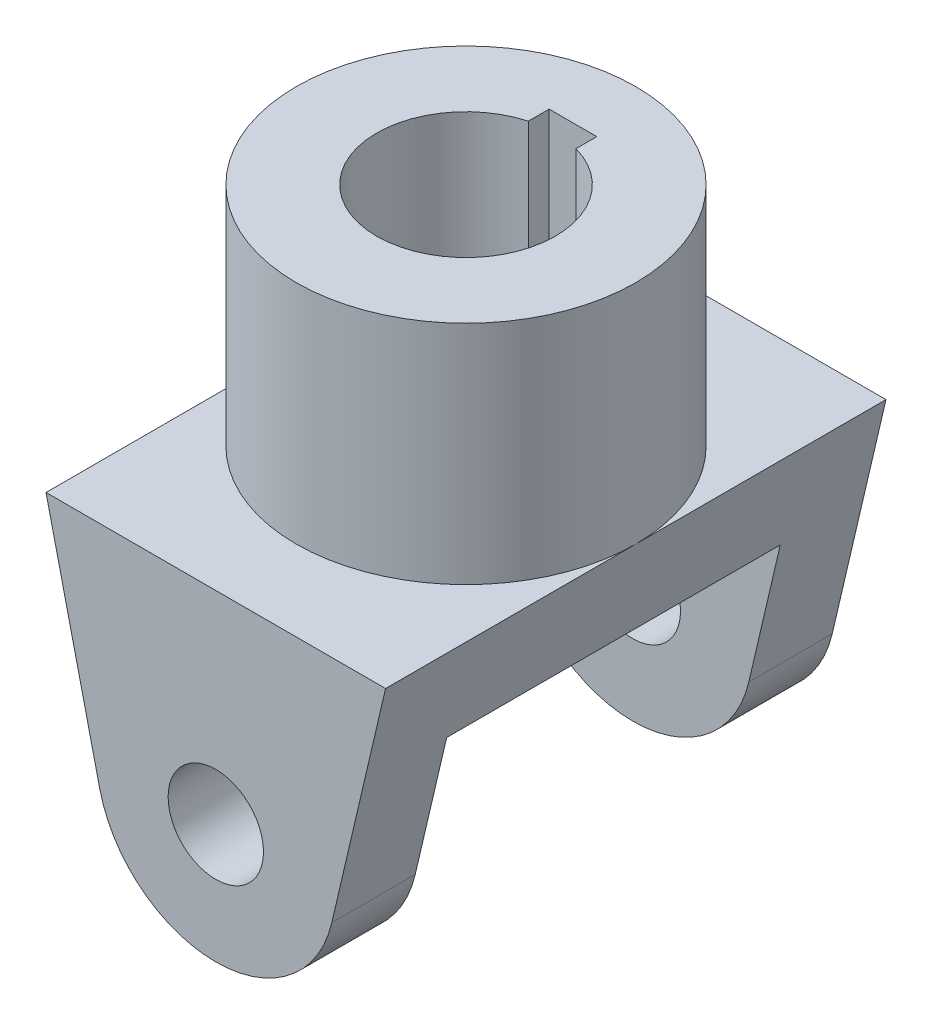
ISO-10303-21;
HEADER;
FILE_DESCRIPTION(('STEP AP214'),'2;1');
FILE_NAME('part.step','',(''),(''),'','','');
FILE_SCHEMA(('AUTOMOTIVE_DESIGN { 1 0 10303 214 1 1 1 1 }'));
ENDSEC;
DATA;
#1=APPLICATION_CONTEXT('core data for automotive mechanical design processes');
#2=APPLICATION_PROTOCOL_DEFINITION('international standard','automotive_design',2000,#1);
#3=PRODUCT_CONTEXT('',#1,'mechanical');
#4=PRODUCT('Part','Part','',(#3));
#5=PRODUCT_RELATED_PRODUCT_CATEGORY('part','',(#4));
#6=PRODUCT_DEFINITION_FORMATION('','',#4);
#7=PRODUCT_DEFINITION_CONTEXT('part definition',#1,'design');
#8=PRODUCT_DEFINITION('design','',#6,#7);
#9=PRODUCT_DEFINITION_SHAPE('','',#8);
#10=(LENGTH_UNIT() NAMED_UNIT(*) SI_UNIT(.MILLI.,.METRE.));
#11=(NAMED_UNIT(*) PLANE_ANGLE_UNIT() SI_UNIT($,.RADIAN.));
#12=(NAMED_UNIT(*) SI_UNIT($,.STERADIAN.) SOLID_ANGLE_UNIT());
#13=UNCERTAINTY_MEASURE_WITH_UNIT(LENGTH_MEASURE(1.E-05),#10,'distance_accuracy_value','');
#14=(GEOMETRIC_REPRESENTATION_CONTEXT(3) GLOBAL_UNCERTAINTY_ASSIGNED_CONTEXT((#13)) GLOBAL_UNIT_ASSIGNED_CONTEXT((#10,
#11,#12)) REPRESENTATION_CONTEXT('',''));
#15=CARTESIAN_POINT('',(0.,0.,0.));
#16=DIRECTION('',(0.,0.,1.));
#17=DIRECTION('',(1.,0.,0.));
#18=AXIS2_PLACEMENT_3D('',#15,#16,#17);
#19=CARTESIAN_POINT('',(14.249999999999,-9.0461251265875,-20.9555072584057));
#20=DIRECTION('',(0.,0.,1.));
#21=DIRECTION('',(1.,0.,0.));
#22=AXIS2_PLACEMENT_3D('',#19,#20,#21);
#23=PLANE('',#22);
#24=CARTESIAN_POINT('',(-9.84302862773668E-13,-18.0461251265875,-20.9555072584057));
#25=DIRECTION('',(0.,0.,-1.));
#26=DIRECTION('',(-1.,0.,0.));
#27=AXIS2_PLACEMENT_3D('',#24,#25,#26);
#28=CIRCLE('',#27,4.);
#29=CARTESIAN_POINT('',(-4.00000000000098,-18.0461251265875,-20.9555072584057));
#30=VERTEX_POINT('',#29);
#31=EDGE_CURVE('E275',#30,#30,#28,.T.);
#32=ORIENTED_EDGE('',*,*,#31,.F.);
#33=EDGE_LOOP('',(#32));
#34=FACE_BOUND('',#33,.T.);
#35=DIRECTION('',(-0.227934655607735,-0.973676431250641,0.));
#36=VECTOR('',#35,1.);
#37=CARTESIAN_POINT('',(13.509652547014,-4.20869320552188,-20.9555072584058));
#38=LINE('',#37,#36);
#39=CARTESIAN_POINT('',(14.249999999999,-1.0461251265875,-20.9555072584058));
#40=VERTEX_POINT('',#39);
#41=CARTESIAN_POINT('',(9.73676111227616,-20.3254853531527,-20.9555072584058));
#42=VERTEX_POINT('',#41);
#43=EDGE_CURVE('E288',#40,#42,#38,.T.);
#44=ORIENTED_EDGE('',*,*,#43,.T.);
#45=CARTESIAN_POINT('',(-9.8941573196602E-13,-18.0461251265875,-20.9555072584058));
#46=DIRECTION('',(0.,0.,1.));
#47=DIRECTION('',(1.,0.,0.));
#48=AXIS2_PLACEMENT_3D('',#45,#46,#47);
#49=CIRCLE('',#48,9.99999999999999);
#50=CARTESIAN_POINT('',(-9.73676431250852,-20.32547168266,-20.9555072584058));
#51=VERTEX_POINT('',#50);
#52=EDGE_CURVE('E263',#51,#42,#49,.T.);
#53=ORIENTED_EDGE('',*,*,#52,.F.);
#54=DIRECTION('',(0.22793465560725,-0.973676431250754,0.));
#55=VECTOR('',#54,1.);
#56=CARTESIAN_POINT('',(-13.5096525470192,-4.20869320551552,-20.9555072584058));
#57=LINE('',#56,#55);
#58=CARTESIAN_POINT('',(-14.250000000001,-1.0461251265875,-20.9555072584058));
#59=VERTEX_POINT('',#58);
#60=EDGE_CURVE('E265',#59,#51,#57,.T.);
#61=ORIENTED_EDGE('',*,*,#60,.F.);
#62=DIRECTION('',(1.,0.,0.));
#63=VECTOR('',#62,1.);
#64=CARTESIAN_POINT('',(14.249999999999,-1.0461251265875,-20.9555072584057));
#65=LINE('',#64,#63);
#66=EDGE_CURVE('E231',#59,#40,#65,.T.);
#67=ORIENTED_EDGE('',*,*,#66,.T.);
#68=EDGE_LOOP('',(#44,#53,#61,#67));
#69=FACE_BOUND('',#68,.T.);
#70=ADVANCED_FACE('F65',(#34,#69),#23,.F.);
#71=CARTESIAN_POINT('',(14.249999999999,-9.0461251265875,21.0444927415943));
#72=DIRECTION('',(0.,0.,-1.));
#73=DIRECTION('',(-1.,0.,0.));
#74=AXIS2_PLACEMENT_3D('',#71,#72,#73);
#75=PLANE('',#74);
#76=CARTESIAN_POINT('',(-9.8941573196602E-13,-18.0461251265875,21.0444927415943));
#77=DIRECTION('',(0.,0.,-1.));
#78=DIRECTION('',(-1.,0.,0.));
#79=AXIS2_PLACEMENT_3D('',#76,#77,#78);
#80=CIRCLE('',#79,4.);
#81=CARTESIAN_POINT('',(-4.00000000000099,-18.0461251265875,21.0444927415943));
#82=VERTEX_POINT('',#81);
#83=EDGE_CURVE('E201',#82,#82,#80,.T.);
#84=ORIENTED_EDGE('',*,*,#83,.T.);
#85=EDGE_LOOP('',(#84));
#86=FACE_BOUND('',#85,.T.);
#87=CARTESIAN_POINT('',(-9.8941573196602E-13,-18.0461251265875,21.0444927415943));
#88=DIRECTION('',(0.,0.,1.));
#89=DIRECTION('',(1.,0.,0.));
#90=AXIS2_PLACEMENT_3D('',#87,#88,#89);
#91=CIRCLE('',#90,9.99999999999999);
#92=CARTESIAN_POINT('',(-9.73676431250852,-20.32547168266,21.0444927415943));
#93=VERTEX_POINT('',#92);
#94=CARTESIAN_POINT('',(9.73676111227616,-20.3254853531527,21.0444927415943));
#95=VERTEX_POINT('',#94);
#96=EDGE_CURVE('E252',#93,#95,#91,.T.);
#97=ORIENTED_EDGE('',*,*,#96,.T.);
#98=DIRECTION('',(-0.227934655607735,-0.973676431250641,0.));
#99=VECTOR('',#98,1.);
#100=CARTESIAN_POINT('',(13.509652547014,-4.20869320552188,21.0444927415943));
#101=LINE('',#100,#99);
#102=CARTESIAN_POINT('',(14.249999999999,-1.0461251265875,21.0444927415943));
#103=VERTEX_POINT('',#102);
#104=EDGE_CURVE('E242',#103,#95,#101,.T.);
#105=ORIENTED_EDGE('',*,*,#104,.F.);
#106=DIRECTION('',(-1.,0.,0.));
#107=VECTOR('',#106,1.);
#108=CARTESIAN_POINT('',(14.249999999999,-1.0461251265875,21.0444927415943));
#109=LINE('',#108,#107);
#110=CARTESIAN_POINT('',(-14.250000000001,-1.0461251265875,21.0444927415943));
#111=VERTEX_POINT('',#110);
#112=EDGE_CURVE('E183',#103,#111,#109,.T.);
#113=ORIENTED_EDGE('',*,*,#112,.T.);
#114=DIRECTION('',(0.22793465560725,-0.973676431250754,0.));
#115=VECTOR('',#114,1.);
#116=CARTESIAN_POINT('',(-13.5096525470192,-4.20869320551552,21.0444927415943));
#117=LINE('',#116,#115);
#118=EDGE_CURVE('E260',#111,#93,#117,.T.);
#119=ORIENTED_EDGE('',*,*,#118,.T.);
#120=EDGE_LOOP('',(#97,#105,#113,#119));
#121=FACE_BOUND('',#120,.T.);
#122=ADVANCED_FACE('F248',(#86,#121),#75,.F.);
#123=CARTESIAN_POINT('',(-9.82450568892913E-13,-1.0461251265875,14.0444927415943));
#124=DIRECTION('',(0.,0.,1.));
#125=DIRECTION('',(1.,0.,0.));
#126=AXIS2_PLACEMENT_3D('',#123,#124,#125);
#127=PLANE('',#126);
#128=CARTESIAN_POINT('',(-9.88563587100628E-13,-18.0461251265875,14.0444927415943));
#129=DIRECTION('',(0.,0.,1.));
#130=DIRECTION('',(1.,0.,0.));
#131=AXIS2_PLACEMENT_3D('',#128,#129,#130);
#132=CIRCLE('',#131,4.);
#133=CARTESIAN_POINT('',(-4.00000000000099,-18.0461251265875,14.0444927415943));
#134=VERTEX_POINT('',#133);
#135=EDGE_CURVE('E200',#134,#134,#132,.T.);
#136=ORIENTED_EDGE('',*,*,#135,.T.);
#137=EDGE_LOOP('',(#136));
#138=FACE_BOUND('',#137,.T.);
#139=DIRECTION('',(-0.227934655607735,-0.973676431250641,0.));
#140=VECTOR('',#139,1.);
#141=CARTESIAN_POINT('',(13.509652547014,-4.20869320552188,14.0444927415943));
#142=LINE('',#141,#140);
#143=CARTESIAN_POINT('',(12.3772246237688,-9.0461251265875,14.0444927415943));
#144=VERTEX_POINT('',#143);
#145=CARTESIAN_POINT('',(9.73676111227616,-20.3254853531527,14.0444927415943));
#146=VERTEX_POINT('',#145);
#147=EDGE_CURVE('E267',#144,#146,#142,.T.);
#148=ORIENTED_EDGE('',*,*,#147,.T.);
#149=CARTESIAN_POINT('',(-9.8941573196602E-13,-18.0461251265875,14.0444927415943));
#150=DIRECTION('',(0.,0.,1.));
#151=DIRECTION('',(1.,0.,0.));
#152=AXIS2_PLACEMENT_3D('',#149,#150,#151);
#153=CIRCLE('',#152,9.99999999999999);
#154=CARTESIAN_POINT('',(-9.73676431250852,-20.32547168266,14.0444927415943));
#155=VERTEX_POINT('',#154);
#156=EDGE_CURVE('E273',#155,#146,#153,.T.);
#157=ORIENTED_EDGE('',*,*,#156,.F.);
#158=DIRECTION('',(0.22793465560725,-0.973676431250754,0.));
#159=VECTOR('',#158,1.);
#160=CARTESIAN_POINT('',(-13.5096525470192,-4.20869320551552,14.0444927415943));
#161=LINE('',#160,#159);
#162=CARTESIAN_POINT('',(-12.377224623775,-9.0461251265875,14.0444927415943));
#163=VERTEX_POINT('',#162);
#164=EDGE_CURVE('E216',#163,#155,#161,.T.);
#165=ORIENTED_EDGE('',*,*,#164,.F.);
#166=DIRECTION('',(-1.,0.,0.));
#167=VECTOR('',#166,1.);
#168=CARTESIAN_POINT('',(-14.250000000001,-9.0461251265875,14.0444927415943));
#169=LINE('',#168,#167);
#170=EDGE_CURVE('E69',#144,#163,#169,.T.);
#171=ORIENTED_EDGE('',*,*,#170,.F.);
#172=EDGE_LOOP('',(#148,#157,#165,#171));
#173=FACE_BOUND('',#172,.T.);
#174=ADVANCED_FACE('F305',(#138,#173),#127,.F.);
#175=CARTESIAN_POINT('',(-9.80746279162129E-13,-1.0461251265875,-13.9555072584057));
#176=DIRECTION('',(0.,0.,-1.));
#177=DIRECTION('',(-1.,0.,0.));
#178=AXIS2_PLACEMENT_3D('',#175,#176,#177);
#179=PLANE('',#178);
#180=CARTESIAN_POINT('',(-9.8515500763906E-13,-18.0461251265875,-13.9555072584057));
#181=DIRECTION('',(0.,0.,-1.));
#182=DIRECTION('',(-1.,0.,0.));
#183=AXIS2_PLACEMENT_3D('',#180,#181,#182);
#184=CIRCLE('',#183,4.);
#185=CARTESIAN_POINT('',(-4.00000000000098,-18.0461251265875,-13.9555072584057));
#186=VERTEX_POINT('',#185);
#187=EDGE_CURVE('E197',#186,#186,#184,.T.);
#188=ORIENTED_EDGE('',*,*,#187,.T.);
#189=EDGE_LOOP('',(#188));
#190=FACE_BOUND('',#189,.T.);
#191=CARTESIAN_POINT('',(-9.8941573196602E-13,-18.0461251265875,-13.9555072584057));
#192=DIRECTION('',(0.,0.,-1.));
#193=DIRECTION('',(-1.,0.,0.));
#194=AXIS2_PLACEMENT_3D('',#191,#192,#193);
#195=CIRCLE('',#194,9.99999999999999);
#196=CARTESIAN_POINT('',(9.73676111227616,-20.3254853531527,-13.9555072584057));
#197=VERTEX_POINT('',#196);
#198=CARTESIAN_POINT('',(-9.73676431250852,-20.32547168266,-13.9555072584058));
#199=VERTEX_POINT('',#198);
#200=EDGE_CURVE('E12',#197,#199,#195,.T.);
#201=ORIENTED_EDGE('',*,*,#200,.F.);
#202=DIRECTION('',(0.227934655607735,0.973676431250641,0.));
#203=VECTOR('',#202,1.);
#204=CARTESIAN_POINT('',(13.509652547014,-4.20869320552188,-13.9555072584057));
#205=LINE('',#204,#203);
#206=CARTESIAN_POINT('',(12.3772246237688,-9.0461251265875,-13.9555072584057));
#207=VERTEX_POINT('',#206);
#208=EDGE_CURVE('E221',#197,#207,#205,.T.);
#209=ORIENTED_EDGE('',*,*,#208,.T.);
#210=DIRECTION('',(1.,0.,0.));
#211=VECTOR('',#210,1.);
#212=CARTESIAN_POINT('',(14.249999999999,-9.0461251265875,-13.9555072584057));
#213=LINE('',#212,#211);
#214=CARTESIAN_POINT('',(-12.377224623775,-9.0461251265875,-13.9555072584058));
#215=VERTEX_POINT('',#214);
#216=EDGE_CURVE('E214',#215,#207,#213,.T.);
#217=ORIENTED_EDGE('',*,*,#216,.F.);
#218=DIRECTION('',(-0.22793465560725,0.973676431250754,0.));
#219=VECTOR('',#218,1.);
#220=CARTESIAN_POINT('',(-13.5096525470192,-4.20869320551552,-13.9555072584058));
#221=LINE('',#220,#219);
#222=EDGE_CURVE('E75',#199,#215,#221,.T.);
#223=ORIENTED_EDGE('',*,*,#222,.F.);
#224=EDGE_LOOP('',(#201,#209,#217,#223));
#225=FACE_BOUND('',#224,.T.);
#226=ADVANCED_FACE('F219',(#190,#225),#179,.F.);
#227=CARTESIAN_POINT('',(-9.82450568892913E-13,-9.0461251265875,0.0444927415942565));
#228=DIRECTION('',(0.,1.,0.));
#229=DIRECTION('',(0.,0.,1.));
#230=AXIS2_PLACEMENT_3D('',#227,#228,#229);
#231=PLANE('',#230);
#232=ORIENTED_EDGE('',*,*,#216,.T.);
#233=DIRECTION('',(0.,0.,1.));
#234=VECTOR('',#233,1.);
#235=CARTESIAN_POINT('',(12.3772246237688,-9.0461251265875,0.0444927415942565));
#236=LINE('',#235,#234);
#237=EDGE_CURVE('E298',#207,#144,#236,.T.);
#238=ORIENTED_EDGE('',*,*,#237,.T.);
#239=ORIENTED_EDGE('',*,*,#170,.T.);
#240=DIRECTION('',(0.,0.,1.));
#241=VECTOR('',#240,1.);
#242=CARTESIAN_POINT('',(-12.377224623775,-9.0461251265875,0.0444927415942565));
#243=LINE('',#242,#241);
#244=EDGE_CURVE('E206',#215,#163,#243,.T.);
#245=ORIENTED_EDGE('',*,*,#244,.F.);
#246=EDGE_LOOP('',(#232,#238,#239,#245));
#247=FACE_BOUND('',#246,.T.);
#248=ADVANCED_FACE('F212',(#247),#231,.F.);
#249=CARTESIAN_POINT('',(-9.82450568892913E-13,17.9538748734125,0.0444927415942565));
#250=DIRECTION('',(0.,1.,0.));
#251=DIRECTION('',(0.,0.,1.));
#252=AXIS2_PLACEMENT_3D('',#249,#250,#251);
#253=PLANE('',#252);
#254=DIRECTION('',(0.,0.,1.));
#255=VECTOR('',#254,1.);
#256=CARTESIAN_POINT('',(-2.00000000000098,17.9538748734125,-8.93392340580622));
#257=LINE('',#256,#255);
#258=CARTESIAN_POINT('',(-2.00000000000098,17.9538748734125,-8.93392340580622));
#259=VERTEX_POINT('',#258);
#260=CARTESIAN_POINT('',(-2.00000000000098,17.9538748734125,-7.18392340580622));
#261=VERTEX_POINT('',#260);
#262=EDGE_CURVE('E346',#259,#261,#257,.T.);
#263=ORIENTED_EDGE('',*,*,#262,.F.);
#264=DIRECTION('',(-1.,0.,0.));
#265=VECTOR('',#264,1.);
#266=CARTESIAN_POINT('',(-2.00000000000098,17.9538748734125,-8.93392340580622));
#267=LINE('',#266,#265);
#268=CARTESIAN_POINT('',(1.99999999999902,17.9538748734125,-8.93392340580622));
#269=VERTEX_POINT('',#268);
#270=EDGE_CURVE('E424',#269,#259,#267,.T.);
#271=ORIENTED_EDGE('',*,*,#270,.F.);
#272=DIRECTION('',(0.,0.,-1.));
#273=VECTOR('',#272,1.);
#274=CARTESIAN_POINT('',(1.99999999999902,17.9538748734125,-8.93392340580622));
#275=LINE('',#274,#273);
#276=CARTESIAN_POINT('',(1.99999999999902,17.9538748734125,-7.18392340580622));
#277=VERTEX_POINT('',#276);
#278=EDGE_CURVE('E425',#277,#269,#275,.T.);
#279=ORIENTED_EDGE('',*,*,#278,.F.);
#280=CARTESIAN_POINT('',(-9.82450568892913E-13,17.9538748734125,0.0444927415942565));
#281=DIRECTION('',(0.,1.,0.));
#282=DIRECTION('',(0.,0.,1.));
#283=AXIS2_PLACEMENT_3D('',#280,#281,#282);
#284=CIRCLE('',#283,7.5);
#285=EDGE_CURVE('E179',#261,#277,#284,.T.);
#286=ORIENTED_EDGE('',*,*,#285,.F.);
#287=EDGE_LOOP('',(#263,#271,#279,#286));
#288=FACE_BOUND('',#287,.T.);
#289=CARTESIAN_POINT('',(-9.82450568892913E-13,17.9538748734125,0.0444927415942565));
#290=DIRECTION('',(0.,1.,0.));
#291=DIRECTION('',(0.,0.,1.));
#292=AXIS2_PLACEMENT_3D('',#289,#290,#291);
#293=CIRCLE('',#292,14.25);
#294=CARTESIAN_POINT('',(-9.82450568892913E-13,17.9538748734125,14.2944927415943));
#295=VERTEX_POINT('',#294);
#296=EDGE_CURVE('E191',#295,#295,#293,.T.);
#297=ORIENTED_EDGE('',*,*,#296,.T.);
#298=EDGE_LOOP('',(#297));
#299=FACE_BOUND('',#298,.T.);
#300=ADVANCED_FACE('F329',(#288,#299),#253,.T.);
#301=CARTESIAN_POINT('',(-9.82450568892913E-13,17.9538748734125,0.0444927415942565));
#302=DIRECTION('',(0.,-1.,0.));
#303=DIRECTION('',(0.,0.,-1.));
#304=AXIS2_PLACEMENT_3D('',#301,#302,#303);
#305=CYLINDRICAL_SURFACE('',#304,14.25);
#306=ORIENTED_EDGE('',*,*,#296,.F.);
#307=EDGE_LOOP('',(#306));
#308=FACE_BOUND('',#307,.T.);
#309=CARTESIAN_POINT('',(-9.82450568892913E-13,-1.0461251265875,0.0444927415942565));
#310=DIRECTION('',(0.,1.,0.));
#311=DIRECTION('',(0.,0.,1.));
#312=AXIS2_PLACEMENT_3D('',#309,#310,#311);
#313=CIRCLE('',#312,14.25);
#314=CARTESIAN_POINT('',(14.249999999999,-1.0461251265875,0.04449274159426));
#315=VERTEX_POINT('',#314);
#316=CARTESIAN_POINT('',(-14.250000000001,-1.0461251265875,0.0444927415942635));
#317=VERTEX_POINT('',#316);
#318=EDGE_CURVE('E194',#315,#317,#313,.T.);
#319=ORIENTED_EDGE('',*,*,#318,.T.);
#320=EDGE_CURVE('E185',#317,#315,#313,.T.);
#321=ORIENTED_EDGE('',*,*,#320,.T.);
#322=EDGE_LOOP('',(#319,#321));
#323=FACE_BOUND('',#322,.T.);
#324=ADVANCED_FACE('F67',(#308,#323),#305,.T.);
#325=CARTESIAN_POINT('',(-9.82450568892913E-13,17.9538748734125,0.0444927415942565));
#326=DIRECTION('',(0.,-1.,0.));
#327=DIRECTION('',(0.,0.,-1.));
#328=AXIS2_PLACEMENT_3D('',#325,#326,#327);
#329=CYLINDRICAL_SURFACE('',#328,7.5);
#330=DIRECTION('',(0.,1.,0.));
#331=VECTOR('',#330,1.);
#332=CARTESIAN_POINT('',(-2.00000000000098,-1.04612512658751,-7.18392340580622));
#333=LINE('',#332,#331);
#334=CARTESIAN_POINT('',(-2.00000000000098,-1.0461251265875,-7.18392340580622));
#335=VERTEX_POINT('',#334);
#336=EDGE_CURVE('E180',#335,#261,#333,.T.);
#337=ORIENTED_EDGE('',*,*,#336,.T.);
#338=ORIENTED_EDGE('',*,*,#285,.T.);
#339=DIRECTION('',(0.,1.,0.));
#340=VECTOR('',#339,1.);
#341=CARTESIAN_POINT('',(1.99999999999902,-1.04612512658751,-7.18392340580622));
#342=LINE('',#341,#340);
#343=CARTESIAN_POINT('',(1.99999999999902,-1.04612512658751,-7.18392340580622));
#344=VERTEX_POINT('',#343);
#345=EDGE_CURVE('E166',#344,#277,#342,.T.);
#346=ORIENTED_EDGE('',*,*,#345,.F.);
#347=CARTESIAN_POINT('',(-9.82450568892913E-13,-1.0461251265875,0.0444927415942565));
#348=DIRECTION('',(0.,1.,0.));
#349=DIRECTION('',(0.,0.,1.));
#350=AXIS2_PLACEMENT_3D('',#347,#348,#349);
#351=CIRCLE('',#350,7.5);
#352=EDGE_CURVE('E177',#335,#344,#351,.T.);
#353=ORIENTED_EDGE('',*,*,#352,.F.);
#354=EDGE_LOOP('',(#337,#338,#346,#353));
#355=FACE_BOUND('',#354,.T.);
#356=ADVANCED_FACE('F176',(#355),#329,.F.);
#357=CARTESIAN_POINT('',(-9.82450568892913E-13,-1.0461251265875,0.0444927415942565));
#358=DIRECTION('',(0.,1.,0.));
#359=DIRECTION('',(0.,0.,1.));
#360=AXIS2_PLACEMENT_3D('',#357,#358,#359);
#361=PLANE('',#360);
#362=ORIENTED_EDGE('',*,*,#352,.T.);
#363=DIRECTION('',(0.,0.,-1.));
#364=VECTOR('',#363,1.);
#365=CARTESIAN_POINT('',(1.99999999999902,-1.04612512658751,-8.93392340580622));
#366=LINE('',#365,#364);
#367=CARTESIAN_POINT('',(1.99999999999902,-1.04612512658751,-8.93392340580622));
#368=VERTEX_POINT('',#367);
#369=EDGE_CURVE('E162',#344,#368,#366,.T.);
#370=ORIENTED_EDGE('',*,*,#369,.T.);
#371=DIRECTION('',(-1.,0.,0.));
#372=VECTOR('',#371,1.);
#373=CARTESIAN_POINT('',(-2.00000000000098,-1.04612512658751,-8.93392340580622));
#374=LINE('',#373,#372);
#375=CARTESIAN_POINT('',(-2.00000000000098,-1.04612512658751,-8.93392340580622));
#376=VERTEX_POINT('',#375);
#377=EDGE_CURVE('E170',#368,#376,#374,.T.);
#378=ORIENTED_EDGE('',*,*,#377,.T.);
#379=DIRECTION('',(0.,0.,1.));
#380=VECTOR('',#379,1.);
#381=CARTESIAN_POINT('',(-2.00000000000098,-1.04612512658751,-8.93392340580622));
#382=LINE('',#381,#380);
#383=EDGE_CURVE('E82',#376,#335,#382,.T.);
#384=ORIENTED_EDGE('',*,*,#383,.T.);
#385=EDGE_LOOP('',(#362,#370,#378,#384));
#386=FACE_BOUND('',#385,.T.);
#387=ADVANCED_FACE('F182',(#386),#361,.T.);
#388=ORIENTED_EDGE('',*,*,#318,.F.);
#389=DIRECTION('',(0.,0.,1.));
#390=VECTOR('',#389,1.);
#391=CARTESIAN_POINT('',(14.249999999999,-1.0461251265875,21.0444927415943));
#392=LINE('',#391,#390);
#393=EDGE_CURVE('E188',#40,#315,#392,.T.);
#394=ORIENTED_EDGE('',*,*,#393,.F.);
#395=ORIENTED_EDGE('',*,*,#66,.F.);
#396=DIRECTION('',(0.,0.,-1.));
#397=VECTOR('',#396,1.);
#398=CARTESIAN_POINT('',(-14.250000000001,-1.0461251265875,21.0444927415943));
#399=LINE('',#398,#397);
#400=EDGE_CURVE('E223',#317,#59,#399,.T.);
#401=ORIENTED_EDGE('',*,*,#400,.F.);
#402=EDGE_LOOP('',(#388,#394,#395,#401));
#403=FACE_BOUND('',#402,.T.);
#404=ADVANCED_FACE('F332',(#403),#361,.T.);
#405=ORIENTED_EDGE('',*,*,#320,.F.);
#406=EDGE_CURVE('E229',#111,#317,#399,.T.);
#407=ORIENTED_EDGE('',*,*,#406,.F.);
#408=ORIENTED_EDGE('',*,*,#112,.F.);
#409=EDGE_CURVE('E234',#315,#103,#392,.T.);
#410=ORIENTED_EDGE('',*,*,#409,.F.);
#411=EDGE_LOOP('',(#405,#407,#408,#410));
#412=FACE_BOUND('',#411,.T.);
#413=ADVANCED_FACE('F256',(#412),#361,.T.);
#414=CARTESIAN_POINT('',(-9.8941573196602E-13,-18.0461251265875,21.0444927415943));
#415=DIRECTION('',(0.,0.,-1.));
#416=DIRECTION('',(-1.,0.,0.));
#417=AXIS2_PLACEMENT_3D('',#414,#415,#416);
#418=CYLINDRICAL_SURFACE('',#417,4.);
#419=CARTESIAN_POINT('',(-4.00000000000098,-18.0461251265875,-20.9555072584057));
#420=CARTESIAN_POINT('',(-4.00000000000098,-18.0461251265875,-20.8825905917391));
#421=CARTESIAN_POINT('',(-4.00000000000098,-18.0461251265875,-20.8096739250724));
#422=CARTESIAN_POINT('',(-4.00000000000098,-18.0461251265875,-20.6638405917391));
#423=CARTESIAN_POINT('',(-4.00000000000098,-18.0461251265875,-20.5909239250724));
#424=CARTESIAN_POINT('',(-4.00000000000098,-18.0461251265875,-20.4450905917391));
#425=CARTESIAN_POINT('',(-4.00000000000098,-18.0461251265875,-20.3721739250724));
#426=CARTESIAN_POINT('',(-4.00000000000098,-18.0461251265875,-20.2263405917391));
#427=CARTESIAN_POINT('',(-4.00000000000098,-18.0461251265875,-20.1534239250724));
#428=CARTESIAN_POINT('',(-4.00000000000098,-18.0461251265875,-20.0075905917391));
#429=CARTESIAN_POINT('',(-4.00000000000098,-18.0461251265875,-19.9346739250724));
#430=CARTESIAN_POINT('',(-4.00000000000098,-18.0461251265875,-19.7888405917391));
#431=CARTESIAN_POINT('',(-4.00000000000098,-18.0461251265875,-19.7159239250724));
#432=CARTESIAN_POINT('',(-4.00000000000098,-18.0461251265875,-19.5700905917391));
#433=CARTESIAN_POINT('',(-4.00000000000098,-18.0461251265875,-19.4971739250724));
#434=CARTESIAN_POINT('',(-4.00000000000098,-18.0461251265875,-19.3513405917391));
#435=CARTESIAN_POINT('',(-4.00000000000098,-18.0461251265875,-19.2784239250724));
#436=CARTESIAN_POINT('',(-4.00000000000098,-18.0461251265875,-19.1325905917391));
#437=CARTESIAN_POINT('',(-4.00000000000098,-18.0461251265875,-19.0596739250724));
#438=CARTESIAN_POINT('',(-4.00000000000098,-18.0461251265875,-18.9138405917391));
#439=CARTESIAN_POINT('',(-4.00000000000098,-18.0461251265875,-18.8409239250724));
#440=CARTESIAN_POINT('',(-4.00000000000098,-18.0461251265875,-18.6950905917391));
#441=CARTESIAN_POINT('',(-4.00000000000098,-18.0461251265875,-18.6221739250724));
#442=CARTESIAN_POINT('',(-4.00000000000098,-18.0461251265875,-18.4763405917391));
#443=CARTESIAN_POINT('',(-4.00000000000098,-18.0461251265875,-18.4034239250724));
#444=CARTESIAN_POINT('',(-4.00000000000098,-18.0461251265875,-18.2575905917391));
#445=CARTESIAN_POINT('',(-4.00000000000098,-18.0461251265875,-18.1846739250724));
#446=CARTESIAN_POINT('',(-4.00000000000098,-18.0461251265875,-18.0388405917391));
#447=CARTESIAN_POINT('',(-4.00000000000098,-18.0461251265875,-17.9659239250724));
#448=CARTESIAN_POINT('',(-4.00000000000098,-18.0461251265875,-17.8200905917391));
#449=CARTESIAN_POINT('',(-4.00000000000098,-18.0461251265875,-17.7471739250724));
#450=CARTESIAN_POINT('',(-4.00000000000098,-18.0461251265875,-17.6013405917391));
#451=CARTESIAN_POINT('',(-4.00000000000098,-18.0461251265875,-17.5284239250724));
#452=CARTESIAN_POINT('',(-4.00000000000098,-18.0461251265875,-17.3825905917391));
#453=CARTESIAN_POINT('',(-4.00000000000098,-18.0461251265875,-17.3096739250724));
#454=CARTESIAN_POINT('',(-4.00000000000098,-18.0461251265875,-17.1638405917391));
#455=CARTESIAN_POINT('',(-4.00000000000098,-18.0461251265875,-17.0909239250724));
#456=CARTESIAN_POINT('',(-4.00000000000098,-18.0461251265875,-16.9450905917391));
#457=CARTESIAN_POINT('',(-4.00000000000098,-18.0461251265875,-16.8721739250724));
#458=CARTESIAN_POINT('',(-4.00000000000098,-18.0461251265875,-16.7263405917391));
#459=CARTESIAN_POINT('',(-4.00000000000098,-18.0461251265875,-16.6534239250724));
#460=CARTESIAN_POINT('',(-4.00000000000098,-18.0461251265875,-16.5075905917391));
#461=CARTESIAN_POINT('',(-4.00000000000098,-18.0461251265875,-16.4346739250724));
#462=CARTESIAN_POINT('',(-4.00000000000098,-18.0461251265875,-16.2888405917391));
#463=CARTESIAN_POINT('',(-4.00000000000098,-18.0461251265875,-16.2159239250724));
#464=CARTESIAN_POINT('',(-4.00000000000098,-18.0461251265875,-16.0700905917391));
#465=CARTESIAN_POINT('',(-4.00000000000098,-18.0461251265875,-15.9971739250724));
#466=CARTESIAN_POINT('',(-4.00000000000098,-18.0461251265875,-15.8513405917391));
#467=CARTESIAN_POINT('',(-4.00000000000098,-18.0461251265875,-15.7784239250724));
#468=CARTESIAN_POINT('',(-4.00000000000098,-18.0461251265875,-15.6325905917391));
#469=CARTESIAN_POINT('',(-4.00000000000098,-18.0461251265875,-15.5596739250724));
#470=CARTESIAN_POINT('',(-4.00000000000098,-18.0461251265875,-15.4138405917391));
#471=CARTESIAN_POINT('',(-4.00000000000098,-18.0461251265875,-15.3409239250724));
#472=CARTESIAN_POINT('',(-4.00000000000098,-18.0461251265875,-15.1950905917391));
#473=CARTESIAN_POINT('',(-4.00000000000098,-18.0461251265875,-15.1221739250724));
#474=CARTESIAN_POINT('',(-4.00000000000098,-18.0461251265875,-14.9763405917391));
#475=CARTESIAN_POINT('',(-4.00000000000098,-18.0461251265875,-14.9034239250724));
#476=CARTESIAN_POINT('',(-4.00000000000098,-18.0461251265875,-14.7575905917391));
#477=CARTESIAN_POINT('',(-4.00000000000098,-18.0461251265875,-14.6846739250724));
#478=CARTESIAN_POINT('',(-4.00000000000098,-18.0461251265875,-14.5388405917391));
#479=CARTESIAN_POINT('',(-4.00000000000098,-18.0461251265875,-14.4659239250724));
#480=CARTESIAN_POINT('',(-4.00000000000098,-18.0461251265875,-14.3200905917391));
#481=CARTESIAN_POINT('',(-4.00000000000098,-18.0461251265875,-14.2471739250724));
#482=CARTESIAN_POINT('',(-4.00000000000098,-18.0461251265875,-14.1013405917391));
#483=CARTESIAN_POINT('',(-4.00000000000098,-18.0461251265875,-14.0284239250724));
#484=CARTESIAN_POINT('',(-4.00000000000098,-18.0461251265875,-13.9555072584057));
#485=B_SPLINE_CURVE_WITH_KNOTS('',3,(#419,#420,#421,#422,#423,#424,#425,#426,#427,#428,#429,
#430,#431,#432,#433,#434,#435,#436,#437,#438,#439,#440,#441,#442,#443,#444,#445,#446,#447,#448,
#449,#450,#451,#452,#453,#454,#455,#456,#457,#458,#459,#460,#461,#462,#463,#464,#465,#466,#467,
#468,#469,#470,#471,#472,#473,#474,#475,#476,#477,#478,#479,#480,#481,#482,#483,#484),
.UNSPECIFIED.,.F.,.F.,(4,2,2,2,2,2,2,2,2,2,2,2,2,2,2,2,2,2,2,2,2,2,2,2,2,2,2,2,2,2,2,2,4),(0.,
0.218750000000004,0.4375,0.656249999999997,0.875000000000001,1.09375,1.3125,1.53125,1.75,
1.96875000000001,2.1875,2.40625,2.625,2.84375000000001,3.0625,3.28125,3.5,3.71875000000001,
3.9375,4.15625,4.375,4.59375000000001,4.8125,5.03125,5.25,5.46875000000001,5.68750000000001,
5.90625,6.12500000000001,6.34375000000001,6.56250000000001,6.78125,7.00000000000001),.UNSPECIFIED.);
#486=EDGE_CURVE('BSEAM280',#30,#186,#485,.T.);
#487=ORIENTED_EDGE('',*,*,#31,.T.);
#488=ORIENTED_EDGE('',*,*,#187,.F.);
#489=ORIENTED_EDGE('',*,*,#486,.T.);
#490=ORIENTED_EDGE('',*,*,#486,.F.);
#491=EDGE_LOOP('',(#487,#489,#488,#490));
#492=FACE_BOUND('',#491,.T.);
#493=ADVANCED_FACE('F280',(#492),#418,.F.);
#494=CARTESIAN_POINT('',(-4.00000000000099,-18.0461251265875,21.0444927415943));
#495=CARTESIAN_POINT('',(-4.00000000000099,-18.0461251265875,20.9715760749276));
#496=CARTESIAN_POINT('',(-4.00000000000099,-18.0461251265875,20.8986594082609));
#497=CARTESIAN_POINT('',(-4.00000000000099,-18.0461251265875,20.7528260749276));
#498=CARTESIAN_POINT('',(-4.00000000000099,-18.0461251265875,20.6799094082609));
#499=CARTESIAN_POINT('',(-4.00000000000099,-18.0461251265875,20.5340760749276));
#500=CARTESIAN_POINT('',(-4.00000000000099,-18.0461251265875,20.4611594082609));
#501=CARTESIAN_POINT('',(-4.00000000000099,-18.0461251265875,20.3153260749276));
#502=CARTESIAN_POINT('',(-4.00000000000099,-18.0461251265875,20.2424094082609));
#503=CARTESIAN_POINT('',(-4.00000000000099,-18.0461251265875,20.0965760749276));
#504=CARTESIAN_POINT('',(-4.00000000000099,-18.0461251265875,20.0236594082609));
#505=CARTESIAN_POINT('',(-4.00000000000099,-18.0461251265875,19.8778260749276));
#506=CARTESIAN_POINT('',(-4.00000000000099,-18.0461251265875,19.8049094082609));
#507=CARTESIAN_POINT('',(-4.00000000000099,-18.0461251265875,19.6590760749276));
#508=CARTESIAN_POINT('',(-4.00000000000099,-18.0461251265875,19.5861594082609));
#509=CARTESIAN_POINT('',(-4.00000000000099,-18.0461251265875,19.4403260749276));
#510=CARTESIAN_POINT('',(-4.00000000000099,-18.0461251265875,19.3674094082609));
#511=CARTESIAN_POINT('',(-4.00000000000099,-18.0461251265875,19.2215760749276));
#512=CARTESIAN_POINT('',(-4.00000000000099,-18.0461251265875,19.1486594082609));
#513=CARTESIAN_POINT('',(-4.00000000000099,-18.0461251265875,19.0028260749276));
#514=CARTESIAN_POINT('',(-4.00000000000099,-18.0461251265875,18.9299094082609));
#515=CARTESIAN_POINT('',(-4.00000000000099,-18.0461251265875,18.7840760749276));
#516=CARTESIAN_POINT('',(-4.00000000000099,-18.0461251265875,18.7111594082609));
#517=CARTESIAN_POINT('',(-4.00000000000099,-18.0461251265875,18.5653260749276));
#518=CARTESIAN_POINT('',(-4.00000000000099,-18.0461251265875,18.4924094082609));
#519=CARTESIAN_POINT('',(-4.00000000000099,-18.0461251265875,18.3465760749276));
#520=CARTESIAN_POINT('',(-4.00000000000099,-18.0461251265875,18.2736594082609));
#521=CARTESIAN_POINT('',(-4.00000000000099,-18.0461251265875,18.1278260749276));
#522=CARTESIAN_POINT('',(-4.00000000000099,-18.0461251265875,18.0549094082609));
#523=CARTESIAN_POINT('',(-4.00000000000099,-18.0461251265875,17.9090760749276));
#524=CARTESIAN_POINT('',(-4.00000000000099,-18.0461251265875,17.8361594082609));
#525=CARTESIAN_POINT('',(-4.00000000000099,-18.0461251265875,17.6903260749276));
#526=CARTESIAN_POINT('',(-4.00000000000099,-18.0461251265875,17.6174094082609));
#527=CARTESIAN_POINT('',(-4.00000000000099,-18.0461251265875,17.4715760749276));
#528=CARTESIAN_POINT('',(-4.00000000000099,-18.0461251265875,17.3986594082609));
#529=CARTESIAN_POINT('',(-4.00000000000099,-18.0461251265875,17.2528260749276));
#530=CARTESIAN_POINT('',(-4.00000000000099,-18.0461251265875,17.1799094082609));
#531=CARTESIAN_POINT('',(-4.00000000000099,-18.0461251265875,17.0340760749276));
#532=CARTESIAN_POINT('',(-4.00000000000099,-18.0461251265875,16.9611594082609));
#533=CARTESIAN_POINT('',(-4.00000000000099,-18.0461251265875,16.8153260749276));
#534=CARTESIAN_POINT('',(-4.00000000000099,-18.0461251265875,16.7424094082609));
#535=CARTESIAN_POINT('',(-4.00000000000099,-18.0461251265875,16.5965760749276));
#536=CARTESIAN_POINT('',(-4.00000000000099,-18.0461251265875,16.5236594082609));
#537=CARTESIAN_POINT('',(-4.00000000000099,-18.0461251265875,16.3778260749276));
#538=CARTESIAN_POINT('',(-4.00000000000099,-18.0461251265875,16.3049094082609));
#539=CARTESIAN_POINT('',(-4.00000000000099,-18.0461251265875,16.1590760749276));
#540=CARTESIAN_POINT('',(-4.00000000000099,-18.0461251265875,16.0861594082609));
#541=CARTESIAN_POINT('',(-4.00000000000099,-18.0461251265875,15.9403260749276));
#542=CARTESIAN_POINT('',(-4.00000000000099,-18.0461251265875,15.8674094082609));
#543=CARTESIAN_POINT('',(-4.00000000000099,-18.0461251265875,15.7215760749276));
#544=CARTESIAN_POINT('',(-4.00000000000099,-18.0461251265875,15.6486594082609));
#545=CARTESIAN_POINT('',(-4.00000000000099,-18.0461251265875,15.5028260749276));
#546=CARTESIAN_POINT('',(-4.00000000000099,-18.0461251265875,15.4299094082609));
#547=CARTESIAN_POINT('',(-4.00000000000099,-18.0461251265875,15.2840760749276));
#548=CARTESIAN_POINT('',(-4.00000000000099,-18.0461251265875,15.2111594082609));
#549=CARTESIAN_POINT('',(-4.00000000000099,-18.0461251265875,15.0653260749276));
#550=CARTESIAN_POINT('',(-4.00000000000099,-18.0461251265875,14.9924094082609));
#551=CARTESIAN_POINT('',(-4.00000000000099,-18.0461251265875,14.8465760749276));
#552=CARTESIAN_POINT('',(-4.00000000000099,-18.0461251265875,14.7736594082609));
#553=CARTESIAN_POINT('',(-4.00000000000099,-18.0461251265875,14.6278260749276));
#554=CARTESIAN_POINT('',(-4.00000000000099,-18.0461251265875,14.5549094082609));
#555=CARTESIAN_POINT('',(-4.00000000000099,-18.0461251265875,14.4090760749276));
#556=CARTESIAN_POINT('',(-4.00000000000099,-18.0461251265875,14.3361594082609));
#557=CARTESIAN_POINT('',(-4.00000000000099,-18.0461251265875,14.1903260749276));
#558=CARTESIAN_POINT('',(-4.00000000000099,-18.0461251265875,14.1174094082609));
#559=CARTESIAN_POINT('',(-4.00000000000099,-18.0461251265875,14.0444927415943));
#560=B_SPLINE_CURVE_WITH_KNOTS('',3,(#494,#495,#496,#497,#498,#499,#500,#501,#502,#503,#504,
#505,#506,#507,#508,#509,#510,#511,#512,#513,#514,#515,#516,#517,#518,#519,#520,#521,#522,#523,
#524,#525,#526,#527,#528,#529,#530,#531,#532,#533,#534,#535,#536,#537,#538,#539,#540,#541,#542,
#543,#544,#545,#546,#547,#548,#549,#550,#551,#552,#553,#554,#555,#556,#557,#558,#559),
.UNSPECIFIED.,.F.,.F.,(4,2,2,2,2,2,2,2,2,2,2,2,2,2,2,2,2,2,2,2,2,2,2,2,2,2,2,2,2,2,2,2,4),(0.,
0.218749999999997,0.437499999999997,0.656249999999997,0.874999999999997,1.09375,1.3125,1.53125,
1.75,1.96875,2.1875,2.40625,2.625,2.84375,3.0625,3.28125,3.5,3.71875,3.9375,4.15625,4.375,
4.59375,4.81249999999999,5.03125,5.24999999999999,5.46874999999999,5.68749999999999,
5.90624999999999,6.12499999999999,6.34375,6.5625,6.78125,7.),.UNSPECIFIED.);
#561=EDGE_CURVE('BSEAM310',#82,#134,#560,.T.);
#562=ORIENTED_EDGE('',*,*,#83,.F.);
#563=ORIENTED_EDGE('',*,*,#135,.F.);
#564=ORIENTED_EDGE('',*,*,#561,.T.);
#565=ORIENTED_EDGE('',*,*,#561,.F.);
#566=EDGE_LOOP('',(#562,#564,#563,#565));
#567=FACE_BOUND('',#566,.T.);
#568=ADVANCED_FACE('F310',(#567),#418,.F.);
#569=CARTESIAN_POINT('',(-9.8941573196602E-13,-18.0461251265875,-20.9555072584058));
#570=DIRECTION('',(0.,0.,1.));
#571=DIRECTION('',(1.,0.,0.));
#572=AXIS2_PLACEMENT_3D('',#569,#570,#571);
#573=CYLINDRICAL_SURFACE('',#572,9.99999999999999);
#574=ORIENTED_EDGE('',*,*,#156,.T.);
#575=DIRECTION('',(0.,0.,1.));
#576=VECTOR('',#575,1.);
#577=CARTESIAN_POINT('',(9.73676111227616,-20.3254853531527,-20.9555072584058));
#578=LINE('',#577,#576);
#579=EDGE_CURVE('E291',#146,#95,#578,.T.);
#580=ORIENTED_EDGE('',*,*,#579,.T.);
#581=ORIENTED_EDGE('',*,*,#96,.F.);
#582=DIRECTION('',(0.,0.,1.));
#583=VECTOR('',#582,1.);
#584=CARTESIAN_POINT('',(-9.73676431250852,-20.32547168266,-20.9555072584058));
#585=LINE('',#584,#583);
#586=EDGE_CURVE('E262',#155,#93,#585,.T.);
#587=ORIENTED_EDGE('',*,*,#586,.F.);
#588=EDGE_LOOP('',(#574,#580,#581,#587));
#589=FACE_BOUND('',#588,.T.);
#590=ADVANCED_FACE('F308',(#589),#573,.T.);
#591=ORIENTED_EDGE('',*,*,#200,.T.);
#592=EDGE_CURVE('E90',#51,#199,#585,.T.);
#593=ORIENTED_EDGE('',*,*,#592,.F.);
#594=ORIENTED_EDGE('',*,*,#52,.T.);
#595=EDGE_CURVE('E254',#42,#197,#578,.T.);
#596=ORIENTED_EDGE('',*,*,#595,.T.);
#597=EDGE_LOOP('',(#591,#593,#594,#596));
#598=FACE_BOUND('',#597,.T.);
#599=ADVANCED_FACE('F302',(#598),#573,.T.);
#600=CARTESIAN_POINT('',(-13.5096525470192,-4.20869320551552,-20.9555072584058));
#601=DIRECTION('',(-0.973676431250754,-0.22793465560725,0.));
#602=DIRECTION('',(0.22793465560725,-0.973676431250754,0.));
#603=AXIS2_PLACEMENT_3D('',#600,#601,#602);
#604=PLANE('',#603);
#605=ORIENTED_EDGE('',*,*,#164,.T.);
#606=ORIENTED_EDGE('',*,*,#586,.T.);
#607=ORIENTED_EDGE('',*,*,#118,.F.);
#608=ORIENTED_EDGE('',*,*,#406,.T.);
#609=ORIENTED_EDGE('',*,*,#400,.T.);
#610=ORIENTED_EDGE('',*,*,#60,.T.);
#611=ORIENTED_EDGE('',*,*,#592,.T.);
#612=ORIENTED_EDGE('',*,*,#222,.T.);
#613=ORIENTED_EDGE('',*,*,#244,.T.);
#614=EDGE_LOOP('',(#605,#606,#607,#608,#609,#610,#611,#612,#613));
#615=FACE_BOUND('',#614,.T.);
#616=ADVANCED_FACE('F205',(#615),#604,.T.);
#617=CARTESIAN_POINT('',(13.509652547014,-4.20869320552188,-20.9555072584058));
#618=DIRECTION('',(-0.973676431250641,0.227934655607735,0.));
#619=DIRECTION('',(-0.227934655607735,-0.973676431250641,0.));
#620=AXIS2_PLACEMENT_3D('',#617,#618,#619);
#621=PLANE('',#620);
#622=ORIENTED_EDGE('',*,*,#237,.F.);
#623=ORIENTED_EDGE('',*,*,#208,.F.);
#624=ORIENTED_EDGE('',*,*,#595,.F.);
#625=ORIENTED_EDGE('',*,*,#43,.F.);
#626=ORIENTED_EDGE('',*,*,#393,.T.);
#627=ORIENTED_EDGE('',*,*,#409,.T.);
#628=ORIENTED_EDGE('',*,*,#104,.T.);
#629=ORIENTED_EDGE('',*,*,#579,.F.);
#630=ORIENTED_EDGE('',*,*,#147,.F.);
#631=EDGE_LOOP('',(#622,#623,#624,#625,#626,#627,#628,#629,#630));
#632=FACE_BOUND('',#631,.T.);
#633=ADVANCED_FACE('F240',(#632),#621,.F.);
#634=CARTESIAN_POINT('',(-2.00000000000098,-1.04612512658751,-8.93392340580622));
#635=DIRECTION('',(-1.,0.,0.));
#636=DIRECTION('',(0.,0.,1.));
#637=AXIS2_PLACEMENT_3D('',#634,#635,#636);
#638=PLANE('',#637);
#639=ORIENTED_EDGE('',*,*,#262,.T.);
#640=ORIENTED_EDGE('',*,*,#336,.F.);
#641=ORIENTED_EDGE('',*,*,#383,.F.);
#642=DIRECTION('',(0.,1.,0.));
#643=VECTOR('',#642,1.);
#644=CARTESIAN_POINT('',(-2.00000000000098,-1.04612512658751,-8.93392340580622));
#645=LINE('',#644,#643);
#646=EDGE_CURVE('E292',#376,#259,#645,.T.);
#647=ORIENTED_EDGE('',*,*,#646,.T.);
#648=EDGE_LOOP('',(#639,#640,#641,#647));
#649=FACE_BOUND('',#648,.T.);
#650=ADVANCED_FACE('F392',(#649),#638,.F.);
#651=CARTESIAN_POINT('',(-2.00000000000098,-1.04612512658751,-8.93392340580622));
#652=DIRECTION('',(0.,0.,-1.));
#653=DIRECTION('',(-1.,0.,0.));
#654=AXIS2_PLACEMENT_3D('',#651,#652,#653);
#655=PLANE('',#654);
#656=ORIENTED_EDGE('',*,*,#270,.T.);
#657=ORIENTED_EDGE('',*,*,#646,.F.);
#658=ORIENTED_EDGE('',*,*,#377,.F.);
#659=DIRECTION('',(0.,1.,0.));
#660=VECTOR('',#659,1.);
#661=CARTESIAN_POINT('',(1.99999999999902,-1.04612512658751,-8.93392340580622));
#662=LINE('',#661,#660);
#663=EDGE_CURVE('E168',#368,#269,#662,.T.);
#664=ORIENTED_EDGE('',*,*,#663,.T.);
#665=EDGE_LOOP('',(#656,#657,#658,#664));
#666=FACE_BOUND('',#665,.T.);
#667=ADVANCED_FACE('F401',(#666),#655,.F.);
#668=CARTESIAN_POINT('',(1.99999999999902,-1.04612512658751,-8.93392340580622));
#669=DIRECTION('',(1.,0.,0.));
#670=DIRECTION('',(0.,0.,-1.));
#671=AXIS2_PLACEMENT_3D('',#668,#669,#670);
#672=PLANE('',#671);
#673=ORIENTED_EDGE('',*,*,#278,.T.);
#674=ORIENTED_EDGE('',*,*,#663,.F.);
#675=ORIENTED_EDGE('',*,*,#369,.F.);
#676=ORIENTED_EDGE('',*,*,#345,.T.);
#677=EDGE_LOOP('',(#673,#674,#675,#676));
#678=FACE_BOUND('',#677,.T.);
#679=ADVANCED_FACE('F165',(#678),#672,.F.);
#680=CLOSED_SHELL('',(#70,#122,#174,#226,#248,#300,#324,#356,#387,#404,#413,#493,#568,#590,#599,
#616,#633,#650,#667,#679));
#681=MANIFOLD_SOLID_BREP('B2',#680);
#682=ADVANCED_BREP_SHAPE_REPRESENTATION('',(#18,#681),#14);
#683=SHAPE_DEFINITION_REPRESENTATION(#9,#682);
ENDSEC;
END-ISO-10303-21;
